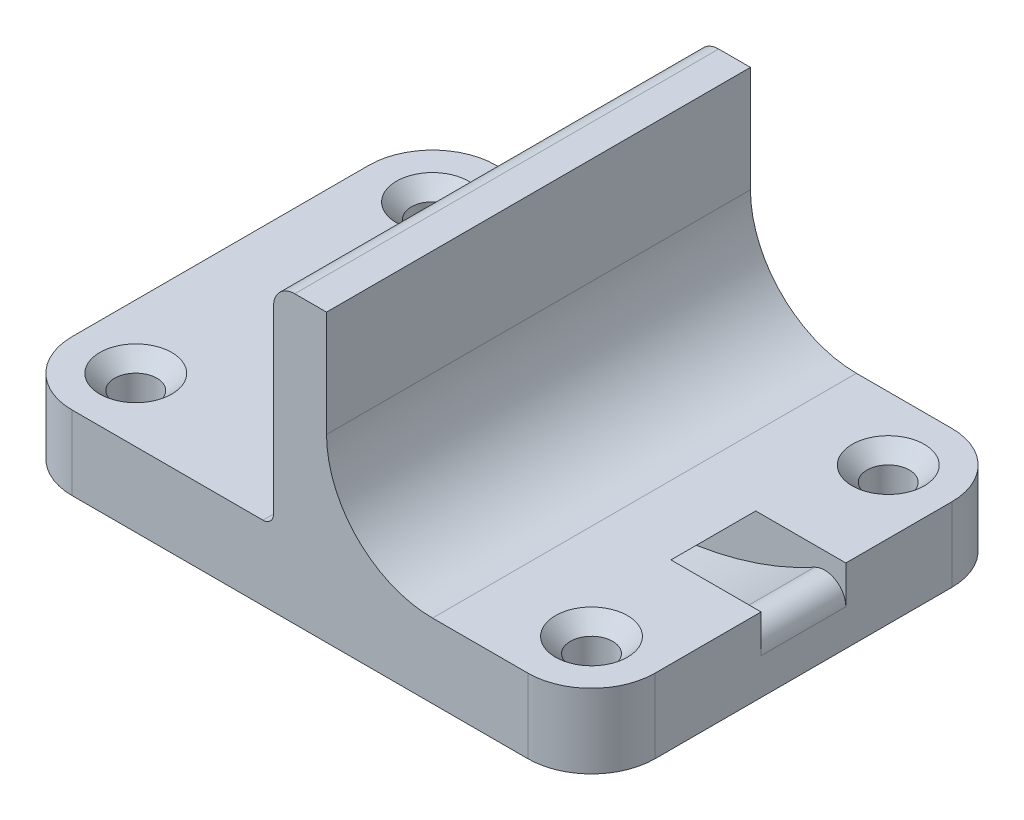
ISO-10303-21;
HEADER;
FILE_DESCRIPTION(('STEP AP214'),'2;1');
FILE_NAME('part.step','',(''),(''),'','','');
FILE_SCHEMA(('AUTOMOTIVE_DESIGN { 1 0 10303 214 1 1 1 1 }'));
ENDSEC;
DATA;
#1=APPLICATION_CONTEXT('core data for automotive mechanical design processes');
#2=APPLICATION_PROTOCOL_DEFINITION('international standard','automotive_design',2000,#1);
#3=PRODUCT_CONTEXT('',#1,'mechanical');
#4=PRODUCT('Part','Part','',(#3));
#5=PRODUCT_RELATED_PRODUCT_CATEGORY('part','',(#4));
#6=PRODUCT_DEFINITION_FORMATION('','',#4);
#7=PRODUCT_DEFINITION_CONTEXT('part definition',#1,'design');
#8=PRODUCT_DEFINITION('design','',#6,#7);
#9=PRODUCT_DEFINITION_SHAPE('','',#8);
#10=(LENGTH_UNIT() NAMED_UNIT(*) SI_UNIT(.MILLI.,.METRE.));
#11=(NAMED_UNIT(*) PLANE_ANGLE_UNIT() SI_UNIT($,.RADIAN.));
#12=(NAMED_UNIT(*) SI_UNIT($,.STERADIAN.) SOLID_ANGLE_UNIT());
#13=UNCERTAINTY_MEASURE_WITH_UNIT(LENGTH_MEASURE(1.E-05),#10,'distance_accuracy_value','');
#14=(GEOMETRIC_REPRESENTATION_CONTEXT(3) GLOBAL_UNCERTAINTY_ASSIGNED_CONTEXT((#13)) GLOBAL_UNIT_ASSIGNED_CONTEXT((#10,
#11,#12)) REPRESENTATION_CONTEXT('',''));
#15=CARTESIAN_POINT('',(0.,0.,0.));
#16=DIRECTION('',(0.,0.,1.));
#17=DIRECTION('',(1.,0.,0.));
#18=AXIS2_PLACEMENT_3D('',#15,#16,#17);
#19=CARTESIAN_POINT('',(25.,0.,40.));
#20=DIRECTION('',(0.,-1.,0.));
#21=DIRECTION('',(1.,0.,0.));
#22=AXIS2_PLACEMENT_3D('',#19,#20,#21);
#23=PLANE('',#22);
#24=CARTESIAN_POINT('',(19.,0.,6.00000000000001));
#25=DIRECTION('',(0.,-1.,0.));
#26=DIRECTION('',(1.,0.,0.));
#27=AXIS2_PLACEMENT_3D('',#24,#25,#26);
#28=CIRCLE('',#27,3.40000000000001);
#29=CARTESIAN_POINT('',(19.,0.,9.40000000000002));
#30=VERTEX_POINT('',#29);
#31=EDGE_CURVE('E363',#30,#30,#28,.T.);
#32=ORIENTED_EDGE('',*,*,#31,.T.);
#33=EDGE_LOOP('',(#32));
#34=FACE_BOUND('',#33,.T.);
#35=CARTESIAN_POINT('',(19.,0.,34.));
#36=DIRECTION('',(0.,-1.,0.));
#37=DIRECTION('',(1.,0.,0.));
#38=AXIS2_PLACEMENT_3D('',#35,#36,#37);
#39=CIRCLE('',#38,3.40000000000001);
#40=CARTESIAN_POINT('',(22.4,0.,34.));
#41=VERTEX_POINT('',#40);
#42=EDGE_CURVE('E359',#41,#41,#39,.T.);
#43=ORIENTED_EDGE('',*,*,#42,.T.);
#44=EDGE_LOOP('',(#43));
#45=FACE_BOUND('',#44,.T.);
#46=DIRECTION('',(0.,0.,-1.));
#47=VECTOR('',#46,1.);
#48=CARTESIAN_POINT('',(25.,0.,40.));
#49=LINE('',#48,#47);
#50=CARTESIAN_POINT('',(25.,0.,16.));
#51=VERTEX_POINT('',#50);
#52=CARTESIAN_POINT('',(25.,0.,6.));
#53=VERTEX_POINT('',#52);
#54=EDGE_CURVE('E267',#51,#53,#49,.T.);
#55=ORIENTED_EDGE('',*,*,#54,.T.);
#56=CARTESIAN_POINT('',(19.,0.,6.));
#57=DIRECTION('',(0.,-1.,0.));
#58=DIRECTION('',(1.,0.,0.));
#59=AXIS2_PLACEMENT_3D('',#56,#57,#58);
#60=CIRCLE('',#59,6.);
#61=CARTESIAN_POINT('',(19.,0.,0.));
#62=VERTEX_POINT('',#61);
#63=EDGE_CURVE('E438',#53,#62,#60,.F.);
#64=ORIENTED_EDGE('',*,*,#63,.T.);
#65=DIRECTION('',(-1.,0.,0.));
#66=VECTOR('',#65,1.);
#67=CARTESIAN_POINT('',(25.,0.,0.));
#68=LINE('',#67,#66);
#69=CARTESIAN_POINT('',(10.,0.,0.));
#70=VERTEX_POINT('',#69);
#71=EDGE_CURVE('E236',#62,#70,#68,.T.);
#72=ORIENTED_EDGE('',*,*,#71,.T.);
#73=DIRECTION('',(0.,0.,-1.));
#74=VECTOR('',#73,1.);
#75=CARTESIAN_POINT('',(10.,0.,40.));
#76=LINE('',#75,#74);
#77=CARTESIAN_POINT('',(10.,0.,40.));
#78=VERTEX_POINT('',#77);
#79=EDGE_CURVE('E417',#70,#78,#76,.F.);
#80=ORIENTED_EDGE('',*,*,#79,.T.);
#81=DIRECTION('',(-1.,0.,0.));
#82=VECTOR('',#81,1.);
#83=CARTESIAN_POINT('',(25.,0.,40.));
#84=LINE('',#83,#82);
#85=CARTESIAN_POINT('',(19.,0.,40.));
#86=VERTEX_POINT('',#85);
#87=EDGE_CURVE('E246',#86,#78,#84,.T.);
#88=ORIENTED_EDGE('',*,*,#87,.F.);
#89=CARTESIAN_POINT('',(19.,0.,34.));
#90=DIRECTION('',(0.,-1.,0.));
#91=DIRECTION('',(1.,0.,0.));
#92=AXIS2_PLACEMENT_3D('',#89,#90,#91);
#93=CIRCLE('',#92,6.);
#94=CARTESIAN_POINT('',(25.,0.,34.));
#95=VERTEX_POINT('',#94);
#96=EDGE_CURVE('E435',#86,#95,#93,.F.);
#97=ORIENTED_EDGE('',*,*,#96,.T.);
#98=CARTESIAN_POINT('',(25.,0.,24.));
#99=VERTEX_POINT('',#98);
#100=EDGE_CURVE('E285',#95,#99,#49,.T.);
#101=ORIENTED_EDGE('',*,*,#100,.T.);
#102=DIRECTION('',(-1.,0.,0.));
#103=VECTOR('',#102,1.);
#104=CARTESIAN_POINT('',(25.,0.,24.));
#105=LINE('',#104,#103);
#106=CARTESIAN_POINT('',(16.4975727583349,0.,24.));
#107=VERTEX_POINT('',#106);
#108=EDGE_CURVE('E234',#99,#107,#105,.T.);
#109=ORIENTED_EDGE('',*,*,#108,.T.);
#110=DIRECTION('',(0.,0.,-1.));
#111=VECTOR('',#110,1.);
#112=CARTESIAN_POINT('',(16.4975727583349,0.,24.));
#113=LINE('',#112,#111);
#114=CARTESIAN_POINT('',(16.4975727583349,0.,16.));
#115=VERTEX_POINT('',#114);
#116=EDGE_CURVE('E211',#107,#115,#113,.T.);
#117=ORIENTED_EDGE('',*,*,#116,.T.);
#118=DIRECTION('',(-1.,0.,0.));
#119=VECTOR('',#118,1.);
#120=CARTESIAN_POINT('',(25.,0.,16.));
#121=LINE('',#120,#119);
#122=EDGE_CURVE('E222',#51,#115,#121,.T.);
#123=ORIENTED_EDGE('',*,*,#122,.F.);
#124=EDGE_LOOP('',(#55,#64,#72,#80,#88,#97,#101,#109,#117,#123));
#125=FACE_BOUND('',#124,.T.);
#126=ADVANCED_FACE('F41',(#34,#45,#125),#23,.F.);
#127=CARTESIAN_POINT('',(0.,0.,40.));
#128=DIRECTION('',(-1.,0.,0.));
#129=DIRECTION('',(0.,0.,1.));
#130=AXIS2_PLACEMENT_3D('',#127,#128,#129);
#131=PLANE('',#130);
#132=DIRECTION('',(0.,1.,0.));
#133=VECTOR('',#132,1.);
#134=CARTESIAN_POINT('',(0.,0.,40.));
#135=LINE('',#134,#133);
#136=CARTESIAN_POINT('',(0.,10.,40.));
#137=VERTEX_POINT('',#136);
#138=CARTESIAN_POINT('',(0.,20.,40.));
#139=VERTEX_POINT('',#138);
#140=EDGE_CURVE('E249',#137,#139,#135,.T.);
#141=ORIENTED_EDGE('',*,*,#140,.F.);
#142=DIRECTION('',(0.,0.,-1.));
#143=VECTOR('',#142,1.);
#144=CARTESIAN_POINT('',(0.,10.,0.));
#145=LINE('',#144,#143);
#146=CARTESIAN_POINT('',(0.,10.,0.));
#147=VERTEX_POINT('',#146);
#148=EDGE_CURVE('E413',#137,#147,#145,.T.);
#149=ORIENTED_EDGE('',*,*,#148,.T.);
#150=DIRECTION('',(0.,1.,0.));
#151=VECTOR('',#150,1.);
#152=CARTESIAN_POINT('',(0.,0.,0.));
#153=LINE('',#152,#151);
#154=CARTESIAN_POINT('',(0.,20.,0.));
#155=VERTEX_POINT('',#154);
#156=EDGE_CURVE('E240',#147,#155,#153,.T.);
#157=ORIENTED_EDGE('',*,*,#156,.T.);
#158=DIRECTION('',(0.,0.,-1.));
#159=VECTOR('',#158,1.);
#160=CARTESIAN_POINT('',(0.,20.,40.));
#161=LINE('',#160,#159);
#162=EDGE_CURVE('E299',#139,#155,#161,.T.);
#163=ORIENTED_EDGE('',*,*,#162,.F.);
#164=EDGE_LOOP('',(#141,#149,#157,#163));
#165=FACE_BOUND('',#164,.T.);
#166=ADVANCED_FACE('F488',(#165),#131,.F.);
#167=CARTESIAN_POINT('',(0.,20.,40.));
#168=DIRECTION('',(0.,-1.,0.));
#169=DIRECTION('',(0.,0.,-1.));
#170=AXIS2_PLACEMENT_3D('',#167,#168,#169);
#171=PLANE('',#170);
#172=DIRECTION('',(-1.,0.,0.));
#173=VECTOR('',#172,1.);
#174=CARTESIAN_POINT('',(0.,20.,0.));
#175=LINE('',#174,#173);
#176=CARTESIAN_POINT('',(-3.,20.,0.));
#177=VERTEX_POINT('',#176);
#178=EDGE_CURVE('E271',#155,#177,#175,.T.);
#179=ORIENTED_EDGE('',*,*,#178,.T.);
#180=DIRECTION('',(0.,0.,-1.));
#181=VECTOR('',#180,1.);
#182=CARTESIAN_POINT('',(-3.,20.,40.));
#183=LINE('',#182,#181);
#184=CARTESIAN_POINT('',(-3.,20.,40.));
#185=VERTEX_POINT('',#184);
#186=EDGE_CURVE('E329',#177,#185,#183,.F.);
#187=ORIENTED_EDGE('',*,*,#186,.T.);
#188=DIRECTION('',(-1.,0.,0.));
#189=VECTOR('',#188,1.);
#190=CARTESIAN_POINT('',(0.,20.,40.));
#191=LINE('',#190,#189);
#192=EDGE_CURVE('E253',#139,#185,#191,.T.);
#193=ORIENTED_EDGE('',*,*,#192,.F.);
#194=ORIENTED_EDGE('',*,*,#162,.T.);
#195=EDGE_LOOP('',(#179,#187,#193,#194));
#196=FACE_BOUND('',#195,.T.);
#197=ADVANCED_FACE('F493',(#196),#171,.F.);
#198=CARTESIAN_POINT('',(-5.,20.,40.));
#199=DIRECTION('',(1.,0.,0.));
#200=DIRECTION('',(0.,1.,0.));
#201=AXIS2_PLACEMENT_3D('',#198,#199,#200);
#202=PLANE('',#201);
#203=DIRECTION('',(0.,-1.,0.));
#204=VECTOR('',#203,1.);
#205=CARTESIAN_POINT('',(-5.,20.,24.));
#206=LINE('',#205,#204);
#207=CARTESIAN_POINT('',(-5.,1.40803957225041,24.));
#208=VERTEX_POINT('',#207);
#209=CARTESIAN_POINT('',(-5.,1.,24.));
#210=VERTEX_POINT('',#209);
#211=EDGE_CURVE('E305',#208,#210,#206,.T.);
#212=ORIENTED_EDGE('',*,*,#211,.T.);
#213=DIRECTION('',(0.,0.,-1.));
#214=VECTOR('',#213,1.);
#215=CARTESIAN_POINT('',(-5.,1.,40.));
#216=LINE('',#215,#214);
#217=CARTESIAN_POINT('',(-5.,1.,40.));
#218=VERTEX_POINT('',#217);
#219=EDGE_CURVE('E398',#210,#218,#216,.F.);
#220=ORIENTED_EDGE('',*,*,#219,.T.);
#221=DIRECTION('',(0.,-1.,0.));
#222=VECTOR('',#221,1.);
#223=CARTESIAN_POINT('',(-5.,20.,40.));
#224=LINE('',#223,#222);
#225=CARTESIAN_POINT('',(-5.,18.,40.));
#226=VERTEX_POINT('',#225);
#227=EDGE_CURVE('E257',#226,#218,#224,.T.);
#228=ORIENTED_EDGE('',*,*,#227,.F.);
#229=DIRECTION('',(0.,0.,-1.));
#230=VECTOR('',#229,1.);
#231=CARTESIAN_POINT('',(-5.,18.,40.));
#232=LINE('',#231,#230);
#233=CARTESIAN_POINT('',(-5.,18.,0.));
#234=VERTEX_POINT('',#233);
#235=EDGE_CURVE('E322',#226,#234,#232,.T.);
#236=ORIENTED_EDGE('',*,*,#235,.T.);
#237=DIRECTION('',(0.,-1.,0.));
#238=VECTOR('',#237,1.);
#239=CARTESIAN_POINT('',(-5.,20.,0.));
#240=LINE('',#239,#238);
#241=CARTESIAN_POINT('',(-5.,1.,0.));
#242=VERTEX_POINT('',#241);
#243=EDGE_CURVE('E275',#234,#242,#240,.T.);
#244=ORIENTED_EDGE('',*,*,#243,.T.);
#245=DIRECTION('',(0.,0.,-1.));
#246=VECTOR('',#245,1.);
#247=CARTESIAN_POINT('',(-5.,1.,16.));
#248=LINE('',#247,#246);
#249=CARTESIAN_POINT('',(-5.,1.,16.));
#250=VERTEX_POINT('',#249);
#251=EDGE_CURVE('E395',#242,#250,#248,.F.);
#252=ORIENTED_EDGE('',*,*,#251,.T.);
#253=DIRECTION('',(0.,1.,0.));
#254=VECTOR('',#253,1.);
#255=CARTESIAN_POINT('',(-5.,27.8841021562439,16.));
#256=LINE('',#255,#254);
#257=CARTESIAN_POINT('',(-5.,1.40803957225041,16.));
#258=VERTEX_POINT('',#257);
#259=EDGE_CURVE('E313',#250,#258,#256,.T.);
#260=ORIENTED_EDGE('',*,*,#259,.T.);
#261=DIRECTION('',(0.,0.,-1.));
#262=VECTOR('',#261,1.);
#263=CARTESIAN_POINT('',(-5.,1.40803957225041,40.));
#264=LINE('',#263,#262);
#265=EDGE_CURVE('E309',#258,#208,#264,.F.);
#266=ORIENTED_EDGE('',*,*,#265,.T.);
#267=EDGE_LOOP('',(#212,#220,#228,#236,#244,#252,#260,#266));
#268=FACE_BOUND('',#267,.T.);
#269=ADVANCED_FACE('F502',(#268),#202,.F.);
#270=CARTESIAN_POINT('',(-5.,0.,40.));
#271=DIRECTION('',(0.,-1.,0.));
#272=DIRECTION('',(1.,0.,0.));
#273=AXIS2_PLACEMENT_3D('',#270,#271,#272);
#274=PLANE('',#273);
#275=CARTESIAN_POINT('',(-24.,0.,34.));
#276=DIRECTION('',(0.,-1.,0.));
#277=DIRECTION('',(1.,0.,0.));
#278=AXIS2_PLACEMENT_3D('',#275,#276,#277);
#279=CIRCLE('',#278,3.39999999999999);
#280=CARTESIAN_POINT('',(-20.6,0.,34.));
#281=VERTEX_POINT('',#280);
#282=EDGE_CURVE('E379',#281,#281,#279,.T.);
#283=ORIENTED_EDGE('',*,*,#282,.T.);
#284=EDGE_LOOP('',(#283));
#285=FACE_BOUND('',#284,.T.);
#286=CARTESIAN_POINT('',(-24.,0.,6.00000000000001));
#287=DIRECTION('',(0.,-1.,0.));
#288=DIRECTION('',(1.,0.,0.));
#289=AXIS2_PLACEMENT_3D('',#286,#287,#288);
#290=CIRCLE('',#289,3.39999999999999);
#291=CARTESIAN_POINT('',(-20.6,0.,6.00000000000001));
#292=VERTEX_POINT('',#291);
#293=EDGE_CURVE('E375',#292,#292,#290,.T.);
#294=ORIENTED_EDGE('',*,*,#293,.T.);
#295=EDGE_LOOP('',(#294));
#296=FACE_BOUND('',#295,.T.);
#297=DIRECTION('',(-1.,0.,0.));
#298=VECTOR('',#297,1.);
#299=CARTESIAN_POINT('',(-5.,0.,0.));
#300=LINE('',#299,#298);
#301=CARTESIAN_POINT('',(-6.,0.,0.));
#302=VERTEX_POINT('',#301);
#303=CARTESIAN_POINT('',(-24.,0.,0.));
#304=VERTEX_POINT('',#303);
#305=EDGE_CURVE('E279',#302,#304,#300,.T.);
#306=ORIENTED_EDGE('',*,*,#305,.T.);
#307=CARTESIAN_POINT('',(-24.,0.,6.));
#308=DIRECTION('',(0.,-1.,0.));
#309=DIRECTION('',(1.,0.,0.));
#310=AXIS2_PLACEMENT_3D('',#307,#308,#309);
#311=CIRCLE('',#310,6.);
#312=CARTESIAN_POINT('',(-30.,0.,6.));
#313=VERTEX_POINT('',#312);
#314=EDGE_CURVE('E63',#304,#313,#311,.F.);
#315=ORIENTED_EDGE('',*,*,#314,.T.);
#316=DIRECTION('',(0.,0.,-1.));
#317=VECTOR('',#316,1.);
#318=CARTESIAN_POINT('',(-30.,0.,40.));
#319=LINE('',#318,#317);
#320=CARTESIAN_POINT('',(-30.,0.,34.));
#321=VERTEX_POINT('',#320);
#322=EDGE_CURVE('E296',#321,#313,#319,.T.);
#323=ORIENTED_EDGE('',*,*,#322,.F.);
#324=CARTESIAN_POINT('',(-24.,0.,34.));
#325=DIRECTION('',(0.,-1.,0.));
#326=DIRECTION('',(1.,0.,0.));
#327=AXIS2_PLACEMENT_3D('',#324,#325,#326);
#328=CIRCLE('',#327,6.);
#329=CARTESIAN_POINT('',(-24.,0.,40.));
#330=VERTEX_POINT('',#329);
#331=EDGE_CURVE('E57',#321,#330,#328,.F.);
#332=ORIENTED_EDGE('',*,*,#331,.T.);
#333=DIRECTION('',(-1.,0.,0.));
#334=VECTOR('',#333,1.);
#335=CARTESIAN_POINT('',(-5.,0.,40.));
#336=LINE('',#335,#334);
#337=CARTESIAN_POINT('',(-6.,0.,40.));
#338=VERTEX_POINT('',#337);
#339=EDGE_CURVE('E261',#338,#330,#336,.T.);
#340=ORIENTED_EDGE('',*,*,#339,.F.);
#341=DIRECTION('',(0.,0.,-1.));
#342=VECTOR('',#341,1.);
#343=CARTESIAN_POINT('',(-6.,0.,24.));
#344=LINE('',#343,#342);
#345=CARTESIAN_POINT('',(-6.,0.,24.));
#346=VERTEX_POINT('',#345);
#347=EDGE_CURVE('E391',#338,#346,#344,.T.);
#348=ORIENTED_EDGE('',*,*,#347,.T.);
#349=DIRECTION('',(-1.,0.,0.));
#350=VECTOR('',#349,1.);
#351=CARTESIAN_POINT('',(-5.,0.,24.));
#352=LINE('',#351,#350);
#353=CARTESIAN_POINT('',(-13.502427241665,0.,24.));
#354=VERTEX_POINT('',#353);
#355=EDGE_CURVE('E242',#346,#354,#352,.T.);
#356=ORIENTED_EDGE('',*,*,#355,.T.);
#357=DIRECTION('',(0.,0.,-1.));
#358=VECTOR('',#357,1.);
#359=CARTESIAN_POINT('',(-13.502427241665,0.,24.));
#360=LINE('',#359,#358);
#361=CARTESIAN_POINT('',(-13.502427241665,0.,16.));
#362=VERTEX_POINT('',#361);
#363=EDGE_CURVE('E230',#362,#354,#360,.F.);
#364=ORIENTED_EDGE('',*,*,#363,.F.);
#365=DIRECTION('',(-1.,0.,0.));
#366=VECTOR('',#365,1.);
#367=CARTESIAN_POINT('',(-5.,0.,16.));
#368=LINE('',#367,#366);
#369=CARTESIAN_POINT('',(-6.,0.,16.));
#370=VERTEX_POINT('',#369);
#371=EDGE_CURVE('E231',#370,#362,#368,.T.);
#372=ORIENTED_EDGE('',*,*,#371,.F.);
#373=DIRECTION('',(0.,0.,-1.));
#374=VECTOR('',#373,1.);
#375=CARTESIAN_POINT('',(-6.,0.,0.));
#376=LINE('',#375,#374);
#377=EDGE_CURVE('E387',#370,#302,#376,.T.);
#378=ORIENTED_EDGE('',*,*,#377,.T.);
#379=EDGE_LOOP('',(#306,#315,#323,#332,#340,#348,#356,#364,#372,#378));
#380=FACE_BOUND('',#379,.T.);
#381=ADVANCED_FACE('F512',(#285,#296,#380),#274,.F.);
#382=CARTESIAN_POINT('',(-30.,0.,40.));
#383=DIRECTION('',(1.,0.,0.));
#384=DIRECTION('',(0.,0.,-1.));
#385=AXIS2_PLACEMENT_3D('',#382,#383,#384);
#386=PLANE('',#385);
#387=ORIENTED_EDGE('',*,*,#322,.T.);
#388=DIRECTION('',(0.,-1.,0.));
#389=VECTOR('',#388,1.);
#390=CARTESIAN_POINT('',(-30.,-7.,6.));
#391=LINE('',#390,#389);
#392=CARTESIAN_POINT('',(-30.,-7.,6.));
#393=VERTEX_POINT('',#392);
#394=EDGE_CURVE('E462',#313,#393,#391,.T.);
#395=ORIENTED_EDGE('',*,*,#394,.T.);
#396=DIRECTION('',(0.,0.,-1.));
#397=VECTOR('',#396,1.);
#398=CARTESIAN_POINT('',(-30.,-7.,40.));
#399=LINE('',#398,#397);
#400=CARTESIAN_POINT('',(-30.,-7.,34.));
#401=VERTEX_POINT('',#400);
#402=EDGE_CURVE('E292',#401,#393,#399,.T.);
#403=ORIENTED_EDGE('',*,*,#402,.F.);
#404=DIRECTION('',(0.,-1.,0.));
#405=VECTOR('',#404,1.);
#406=CARTESIAN_POINT('',(-30.,0.,34.));
#407=LINE('',#406,#405);
#408=EDGE_CURVE('E459',#401,#321,#407,.F.);
#409=ORIENTED_EDGE('',*,*,#408,.T.);
#410=EDGE_LOOP('',(#387,#395,#403,#409));
#411=FACE_BOUND('',#410,.T.);
#412=ADVANCED_FACE('F566',(#411),#386,.F.);
#413=CARTESIAN_POINT('',(-30.,-7.,40.));
#414=DIRECTION('',(0.,1.,0.));
#415=DIRECTION('',(0.,0.,1.));
#416=AXIS2_PLACEMENT_3D('',#413,#414,#415);
#417=PLANE('',#416);
#418=CARTESIAN_POINT('',(19.,-7.,6.00000000000001));
#419=DIRECTION('',(0.,1.,0.));
#420=DIRECTION('',(0.,0.,1.));
#421=AXIS2_PLACEMENT_3D('',#418,#419,#420);
#422=CIRCLE('',#421,2.);
#423=CARTESIAN_POINT('',(19.,-7.,8.00000000000001));
#424=VERTEX_POINT('',#423);
#425=EDGE_CURVE('E548',#424,#424,#422,.F.);
#426=ORIENTED_EDGE('',*,*,#425,.F.);
#427=EDGE_LOOP('',(#426));
#428=FACE_BOUND('',#427,.T.);
#429=CARTESIAN_POINT('',(19.,-7.,34.));
#430=DIRECTION('',(0.,1.,0.));
#431=DIRECTION('',(0.,0.,1.));
#432=AXIS2_PLACEMENT_3D('',#429,#430,#431);
#433=CIRCLE('',#432,2.);
#434=CARTESIAN_POINT('',(19.,-7.,36.));
#435=VERTEX_POINT('',#434);
#436=EDGE_CURVE('E552',#435,#435,#433,.F.);
#437=ORIENTED_EDGE('',*,*,#436,.F.);
#438=EDGE_LOOP('',(#437));
#439=FACE_BOUND('',#438,.T.);
#440=CARTESIAN_POINT('',(-24.,-7.,34.));
#441=DIRECTION('',(0.,1.,0.));
#442=DIRECTION('',(0.,0.,1.));
#443=AXIS2_PLACEMENT_3D('',#440,#441,#442);
#444=CIRCLE('',#443,2.);
#445=CARTESIAN_POINT('',(-24.,-7.,36.));
#446=VERTEX_POINT('',#445);
#447=EDGE_CURVE('E547',#446,#446,#444,.F.);
#448=ORIENTED_EDGE('',*,*,#447,.F.);
#449=EDGE_LOOP('',(#448));
#450=FACE_BOUND('',#449,.T.);
#451=CARTESIAN_POINT('',(-24.,-7.,6.00000000000001));
#452=DIRECTION('',(0.,1.,0.));
#453=DIRECTION('',(0.,0.,1.));
#454=AXIS2_PLACEMENT_3D('',#451,#452,#453);
#455=CIRCLE('',#454,2.);
#456=CARTESIAN_POINT('',(-24.,-7.,8.00000000000001));
#457=VERTEX_POINT('',#456);
#458=EDGE_CURVE('E219',#457,#457,#455,.F.);
#459=ORIENTED_EDGE('',*,*,#458,.F.);
#460=EDGE_LOOP('',(#459));
#461=FACE_BOUND('',#460,.T.);
#462=DIRECTION('',(1.,0.,0.));
#463=VECTOR('',#462,1.);
#464=CARTESIAN_POINT('',(-30.,-7.,0.));
#465=LINE('',#464,#463);
#466=CARTESIAN_POINT('',(-24.,-7.,0.));
#467=VERTEX_POINT('',#466);
#468=CARTESIAN_POINT('',(19.,-7.,0.));
#469=VERTEX_POINT('',#468);
#470=EDGE_CURVE('E250',#467,#469,#465,.T.);
#471=ORIENTED_EDGE('',*,*,#470,.T.);
#472=CARTESIAN_POINT('',(19.,-7.,6.));
#473=DIRECTION('',(0.,1.,0.));
#474=DIRECTION('',(0.,0.,1.));
#475=AXIS2_PLACEMENT_3D('',#472,#473,#474);
#476=CIRCLE('',#475,6.);
#477=CARTESIAN_POINT('',(25.,-7.,6.));
#478=VERTEX_POINT('',#477);
#479=EDGE_CURVE('E456',#469,#478,#476,.F.);
#480=ORIENTED_EDGE('',*,*,#479,.T.);
#481=DIRECTION('',(0.,0.,-1.));
#482=VECTOR('',#481,1.);
#483=CARTESIAN_POINT('',(25.,-7.,40.));
#484=LINE('',#483,#482);
#485=CARTESIAN_POINT('',(25.,-7.,34.));
#486=VERTEX_POINT('',#485);
#487=EDGE_CURVE('E288',#486,#478,#484,.T.);
#488=ORIENTED_EDGE('',*,*,#487,.F.);
#489=CARTESIAN_POINT('',(19.,-7.,34.));
#490=DIRECTION('',(0.,1.,0.));
#491=DIRECTION('',(0.,0.,1.));
#492=AXIS2_PLACEMENT_3D('',#489,#490,#491);
#493=CIRCLE('',#492,6.);
#494=CARTESIAN_POINT('',(19.,-7.,40.));
#495=VERTEX_POINT('',#494);
#496=EDGE_CURVE('E447',#486,#495,#493,.F.);
#497=ORIENTED_EDGE('',*,*,#496,.T.);
#498=DIRECTION('',(1.,0.,0.));
#499=VECTOR('',#498,1.);
#500=CARTESIAN_POINT('',(-30.,-7.,40.));
#501=LINE('',#500,#499);
#502=CARTESIAN_POINT('',(-24.,-7.,40.));
#503=VERTEX_POINT('',#502);
#504=EDGE_CURVE('E264',#503,#495,#501,.T.);
#505=ORIENTED_EDGE('',*,*,#504,.F.);
#506=CARTESIAN_POINT('',(-24.,-7.,34.));
#507=DIRECTION('',(0.,1.,0.));
#508=DIRECTION('',(0.,0.,1.));
#509=AXIS2_PLACEMENT_3D('',#506,#507,#508);
#510=CIRCLE('',#509,6.);
#511=EDGE_CURVE('E450',#503,#401,#510,.F.);
#512=ORIENTED_EDGE('',*,*,#511,.T.);
#513=ORIENTED_EDGE('',*,*,#402,.T.);
#514=CARTESIAN_POINT('',(-24.,-7.,6.));
#515=DIRECTION('',(0.,1.,0.));
#516=DIRECTION('',(0.,0.,1.));
#517=AXIS2_PLACEMENT_3D('',#514,#515,#516);
#518=CIRCLE('',#517,6.);
#519=EDGE_CURVE('E453',#393,#467,#518,.F.);
#520=ORIENTED_EDGE('',*,*,#519,.T.);
#521=EDGE_LOOP('',(#471,#480,#488,#497,#505,#512,#513,#520));
#522=FACE_BOUND('',#521,.T.);
#523=ADVANCED_FACE('F562',(#428,#439,#450,#461,#522),#417,.F.);
#524=CARTESIAN_POINT('',(25.,-7.,40.));
#525=DIRECTION('',(-1.,0.,0.));
#526=DIRECTION('',(0.,0.,1.));
#527=AXIS2_PLACEMENT_3D('',#524,#525,#526);
#528=PLANE('',#527);
#529=ORIENTED_EDGE('',*,*,#487,.T.);
#530=DIRECTION('',(0.,1.,0.));
#531=VECTOR('',#530,1.);
#532=CARTESIAN_POINT('',(25.,0.,6.));
#533=LINE('',#532,#531);
#534=EDGE_CURVE('E431',#478,#53,#533,.T.);
#535=ORIENTED_EDGE('',*,*,#534,.T.);
#536=ORIENTED_EDGE('',*,*,#54,.F.);
#537=DIRECTION('',(0.,-1.,0.));
#538=VECTOR('',#537,1.);
#539=CARTESIAN_POINT('',(25.,27.8841021562439,16.));
#540=LINE('',#539,#538);
#541=CARTESIAN_POINT('',(25.,-3.58118691231785,16.));
#542=VERTEX_POINT('',#541);
#543=EDGE_CURVE('E225',#51,#542,#540,.T.);
#544=ORIENTED_EDGE('',*,*,#543,.T.);
#545=DIRECTION('',(0.,0.,1.));
#546=VECTOR('',#545,1.);
#547=CARTESIAN_POINT('',(25.,-3.58118691231785,24.));
#548=LINE('',#547,#546);
#549=CARTESIAN_POINT('',(25.,-3.58118691231785,24.));
#550=VERTEX_POINT('',#549);
#551=EDGE_CURVE('E343',#542,#550,#548,.T.);
#552=ORIENTED_EDGE('',*,*,#551,.T.);
#553=DIRECTION('',(0.,1.,0.));
#554=VECTOR('',#553,1.);
#555=CARTESIAN_POINT('',(25.,-7.,24.));
#556=LINE('',#555,#554);
#557=EDGE_CURVE('E339',#550,#99,#556,.T.);
#558=ORIENTED_EDGE('',*,*,#557,.T.);
#559=ORIENTED_EDGE('',*,*,#100,.F.);
#560=DIRECTION('',(0.,1.,0.));
#561=VECTOR('',#560,1.);
#562=CARTESIAN_POINT('',(25.,-7.,34.));
#563=LINE('',#562,#561);
#564=EDGE_CURVE('E428',#95,#486,#563,.F.);
#565=ORIENTED_EDGE('',*,*,#564,.T.);
#566=EDGE_LOOP('',(#529,#535,#536,#544,#552,#558,#559,#565));
#567=FACE_BOUND('',#566,.T.);
#568=ADVANCED_FACE('F565',(#567),#528,.F.);
#569=CARTESIAN_POINT('',(0.,0.,40.));
#570=DIRECTION('',(0.,0.,-1.));
#571=DIRECTION('',(-1.,0.,0.));
#572=AXIS2_PLACEMENT_3D('',#569,#570,#571);
#573=PLANE('',#572);
#574=ORIENTED_EDGE('',*,*,#339,.T.);
#575=DIRECTION('',(0.,-1.,0.));
#576=VECTOR('',#575,1.);
#577=CARTESIAN_POINT('',(-24.,0.,40.));
#578=LINE('',#577,#576);
#579=EDGE_CURVE('E11',#330,#503,#578,.T.);
#580=ORIENTED_EDGE('',*,*,#579,.T.);
#581=ORIENTED_EDGE('',*,*,#504,.T.);
#582=DIRECTION('',(0.,1.,0.));
#583=VECTOR('',#582,1.);
#584=CARTESIAN_POINT('',(19.,0.,40.));
#585=LINE('',#584,#583);
#586=EDGE_CURVE('E50',#495,#86,#585,.T.);
#587=ORIENTED_EDGE('',*,*,#586,.T.);
#588=ORIENTED_EDGE('',*,*,#87,.T.);
#589=CARTESIAN_POINT('',(10.,10.,40.));
#590=DIRECTION('',(0.,0.,-1.));
#591=DIRECTION('',(-1.,0.,0.));
#592=AXIS2_PLACEMENT_3D('',#589,#590,#591);
#593=CIRCLE('',#592,10.);
#594=EDGE_CURVE('E425',#78,#137,#593,.T.);
#595=ORIENTED_EDGE('',*,*,#594,.T.);
#596=ORIENTED_EDGE('',*,*,#140,.T.);
#597=ORIENTED_EDGE('',*,*,#192,.T.);
#598=CARTESIAN_POINT('',(-3.,18.,40.));
#599=DIRECTION('',(0.,0.,-1.));
#600=DIRECTION('',(-1.,0.,0.));
#601=AXIS2_PLACEMENT_3D('',#598,#599,#600);
#602=CIRCLE('',#601,2.);
#603=EDGE_CURVE('E332',#185,#226,#602,.F.);
#604=ORIENTED_EDGE('',*,*,#603,.T.);
#605=ORIENTED_EDGE('',*,*,#227,.T.);
#606=CARTESIAN_POINT('',(-6.,1.,40.));
#607=DIRECTION('',(0.,0.,-1.));
#608=DIRECTION('',(-1.,0.,0.));
#609=AXIS2_PLACEMENT_3D('',#606,#607,#608);
#610=CIRCLE('',#609,1.);
#611=EDGE_CURVE('E404',#218,#338,#610,.T.);
#612=ORIENTED_EDGE('',*,*,#611,.T.);
#613=EDGE_LOOP('',(#574,#580,#581,#587,#588,#595,#596,#597,#604,#605,#612));
#614=FACE_BOUND('',#613,.T.);
#615=ADVANCED_FACE('F474',(#614),#573,.F.);
#616=CARTESIAN_POINT('',(0.,0.,0.));
#617=DIRECTION('',(0.,0.,-1.));
#618=DIRECTION('',(-1.,0.,0.));
#619=AXIS2_PLACEMENT_3D('',#616,#617,#618);
#620=PLANE('',#619);
#621=ORIENTED_EDGE('',*,*,#71,.F.);
#622=DIRECTION('',(0.,1.,0.));
#623=VECTOR('',#622,1.);
#624=CARTESIAN_POINT('',(19.,-7.,0.));
#625=LINE('',#624,#623);
#626=EDGE_CURVE('E444',#62,#469,#625,.F.);
#627=ORIENTED_EDGE('',*,*,#626,.T.);
#628=ORIENTED_EDGE('',*,*,#470,.F.);
#629=DIRECTION('',(0.,-1.,0.));
#630=VECTOR('',#629,1.);
#631=CARTESIAN_POINT('',(-24.,0.,0.));
#632=LINE('',#631,#630);
#633=EDGE_CURVE('E441',#467,#304,#632,.F.);
#634=ORIENTED_EDGE('',*,*,#633,.T.);
#635=ORIENTED_EDGE('',*,*,#305,.F.);
#636=CARTESIAN_POINT('',(-6.,1.,0.));
#637=DIRECTION('',(0.,0.,-1.));
#638=DIRECTION('',(-1.,0.,0.));
#639=AXIS2_PLACEMENT_3D('',#636,#637,#638);
#640=CIRCLE('',#639,1.);
#641=EDGE_CURVE('E407',#302,#242,#640,.F.);
#642=ORIENTED_EDGE('',*,*,#641,.T.);
#643=ORIENTED_EDGE('',*,*,#243,.F.);
#644=CARTESIAN_POINT('',(-3.,18.,0.));
#645=DIRECTION('',(0.,0.,-1.));
#646=DIRECTION('',(-1.,0.,0.));
#647=AXIS2_PLACEMENT_3D('',#644,#645,#646);
#648=CIRCLE('',#647,2.);
#649=EDGE_CURVE('E326',#234,#177,#648,.T.);
#650=ORIENTED_EDGE('',*,*,#649,.T.);
#651=ORIENTED_EDGE('',*,*,#178,.F.);
#652=ORIENTED_EDGE('',*,*,#156,.F.);
#653=CARTESIAN_POINT('',(10.,10.,0.));
#654=DIRECTION('',(0.,0.,-1.));
#655=DIRECTION('',(-1.,0.,0.));
#656=AXIS2_PLACEMENT_3D('',#653,#654,#655);
#657=CIRCLE('',#656,10.);
#658=EDGE_CURVE('E421',#147,#70,#657,.F.);
#659=ORIENTED_EDGE('',*,*,#658,.T.);
#660=EDGE_LOOP('',(#621,#627,#628,#634,#635,#642,#643,#650,#651,#652,#659));
#661=FACE_BOUND('',#660,.T.);
#662=ADVANCED_FACE('F505',(#661),#620,.T.);
#663=CARTESIAN_POINT('',(5.74878637916748,27.8841021562439,24.));
#664=DIRECTION('',(0.,0.,-1.));
#665=DIRECTION('',(-1.,0.,0.));
#666=AXIS2_PLACEMENT_3D('',#663,#664,#665);
#667=CYLINDRICAL_SURFACE('',#666,29.8841021562439);
#668=CARTESIAN_POINT('',(5.74878637916748,27.8841021562439,24.));
#669=DIRECTION('',(0.,0.,1.));
#670=DIRECTION('',(1.,0.,0.));
#671=AXIS2_PLACEMENT_3D('',#668,#669,#670);
#672=CIRCLE('',#671,29.8841021562439);
#673=CARTESIAN_POINT('',(-3.6275107105938,-0.490968144450616,24.));
#674=VERTEX_POINT('',#673);
#675=EDGE_CURVE('E522',#674,#107,#672,.T.);
#676=ORIENTED_EDGE('',*,*,#675,.F.);
#677=DIRECTION('',(0.,0.,-1.));
#678=VECTOR('',#677,1.);
#679=CARTESIAN_POINT('',(-3.62751071059381,-0.490968144450616,24.));
#680=LINE('',#679,#678);
#681=CARTESIAN_POINT('',(-3.6275107105938,-0.490968144450616,16.));
#682=VERTEX_POINT('',#681);
#683=EDGE_CURVE('E214',#674,#682,#680,.T.);
#684=ORIENTED_EDGE('',*,*,#683,.T.);
#685=CARTESIAN_POINT('',(5.74878637916748,27.8841021562439,16.));
#686=DIRECTION('',(0.,0.,1.));
#687=DIRECTION('',(1.,0.,0.));
#688=AXIS2_PLACEMENT_3D('',#685,#686,#687);
#689=CIRCLE('',#688,29.8841021562439);
#690=EDGE_CURVE('E206',#682,#115,#689,.T.);
#691=ORIENTED_EDGE('',*,*,#690,.T.);
#692=ORIENTED_EDGE('',*,*,#116,.F.);
#693=EDGE_LOOP('',(#676,#684,#691,#692));
#694=FACE_BOUND('',#693,.T.);
#695=ADVANCED_FACE('F209',(#694),#667,.T.);
#696=CARTESIAN_POINT('',(5.74878637916748,27.8841021562439,24.));
#697=DIRECTION('',(0.,0.,1.));
#698=DIRECTION('',(1.,0.,0.));
#699=AXIS2_PLACEMENT_3D('',#696,#697,#698);
#700=PLANE('',#699);
#701=CARTESIAN_POINT('',(5.74878637916748,27.8841021562439,24.));
#702=DIRECTION('',(0.,0.,1.));
#703=DIRECTION('',(1.,0.,0.));
#704=AXIS2_PLACEMENT_3D('',#701,#702,#703);
#705=CIRCLE('',#704,33.8841021562439);
#706=CARTESIAN_POINT('',(22.0385038173329,-1.82746940635613,24.));
#707=VERTEX_POINT('',#706);
#708=EDGE_CURVE('E518',#354,#707,#705,.T.);
#709=ORIENTED_EDGE('',*,*,#708,.F.);
#710=ORIENTED_EDGE('',*,*,#355,.F.);
#711=CARTESIAN_POINT('',(-6.,1.,24.));
#712=DIRECTION('',(0.,0.,1.));
#713=DIRECTION('',(1.,0.,0.));
#714=AXIS2_PLACEMENT_3D('',#711,#712,#713);
#715=CIRCLE('',#714,1.);
#716=EDGE_CURVE('E401',#346,#210,#715,.T.);
#717=ORIENTED_EDGE('',*,*,#716,.T.);
#718=ORIENTED_EDGE('',*,*,#211,.F.);
#719=CARTESIAN_POINT('',(-3.,1.40803957225041,24.));
#720=DIRECTION('',(0.,0.,1.));
#721=DIRECTION('',(1.,0.,0.));
#722=AXIS2_PLACEMENT_3D('',#719,#720,#721);
#723=CIRCLE('',#722,2.);
#724=EDGE_CURVE('E319',#208,#674,#723,.T.);
#725=ORIENTED_EDGE('',*,*,#724,.T.);
#726=ORIENTED_EDGE('',*,*,#675,.T.);
#727=ORIENTED_EDGE('',*,*,#108,.F.);
#728=ORIENTED_EDGE('',*,*,#557,.F.);
#729=CARTESIAN_POINT('',(23.,-3.58118691231785,24.));
#730=DIRECTION('',(0.,0.,1.));
#731=DIRECTION('',(1.,0.,0.));
#732=AXIS2_PLACEMENT_3D('',#729,#730,#731);
#733=CIRCLE('',#732,2.);
#734=EDGE_CURVE('E352',#550,#707,#733,.T.);
#735=ORIENTED_EDGE('',*,*,#734,.T.);
#736=EDGE_LOOP('',(#709,#710,#717,#718,#725,#726,#727,#728,#735));
#737=FACE_BOUND('',#736,.T.);
#738=ADVANCED_FACE('F535',(#737),#700,.F.);
#739=CARTESIAN_POINT('',(5.74878637916748,27.8841021562439,24.));
#740=DIRECTION('',(0.,0.,-1.));
#741=DIRECTION('',(-1.,0.,0.));
#742=AXIS2_PLACEMENT_3D('',#739,#740,#741);
#743=CYLINDRICAL_SURFACE('',#742,33.8841021562439);
#744=ORIENTED_EDGE('',*,*,#708,.T.);
#745=DIRECTION('',(0.,0.,-1.));
#746=VECTOR('',#745,1.);
#747=CARTESIAN_POINT('',(22.0385038173329,-1.82746940635613,24.));
#748=LINE('',#747,#746);
#749=CARTESIAN_POINT('',(22.0385038173329,-1.82746940635613,16.));
#750=VERTEX_POINT('',#749);
#751=EDGE_CURVE('E335',#707,#750,#748,.T.);
#752=ORIENTED_EDGE('',*,*,#751,.T.);
#753=CARTESIAN_POINT('',(5.74878637916748,27.8841021562439,16.));
#754=DIRECTION('',(0.,0.,1.));
#755=DIRECTION('',(1.,0.,0.));
#756=AXIS2_PLACEMENT_3D('',#753,#754,#755);
#757=CIRCLE('',#756,33.8841021562439);
#758=EDGE_CURVE('E218',#362,#750,#757,.T.);
#759=ORIENTED_EDGE('',*,*,#758,.F.);
#760=ORIENTED_EDGE('',*,*,#363,.T.);
#761=EDGE_LOOP('',(#744,#752,#759,#760));
#762=FACE_BOUND('',#761,.T.);
#763=ADVANCED_FACE('F533',(#762),#743,.F.);
#764=CARTESIAN_POINT('',(5.74878637916748,27.8841021562439,16.));
#765=DIRECTION('',(0.,0.,1.));
#766=DIRECTION('',(1.,0.,0.));
#767=AXIS2_PLACEMENT_3D('',#764,#765,#766);
#768=PLANE('',#767);
#769=ORIENTED_EDGE('',*,*,#122,.T.);
#770=ORIENTED_EDGE('',*,*,#690,.F.);
#771=CARTESIAN_POINT('',(-3.,1.40803957225041,16.));
#772=DIRECTION('',(0.,0.,1.));
#773=DIRECTION('',(1.,0.,0.));
#774=AXIS2_PLACEMENT_3D('',#771,#772,#773);
#775=CIRCLE('',#774,2.);
#776=EDGE_CURVE('E316',#682,#258,#775,.F.);
#777=ORIENTED_EDGE('',*,*,#776,.T.);
#778=ORIENTED_EDGE('',*,*,#259,.F.);
#779=CARTESIAN_POINT('',(-6.,1.,16.));
#780=DIRECTION('',(0.,0.,1.));
#781=DIRECTION('',(1.,0.,0.));
#782=AXIS2_PLACEMENT_3D('',#779,#780,#781);
#783=CIRCLE('',#782,1.);
#784=EDGE_CURVE('E410',#250,#370,#783,.F.);
#785=ORIENTED_EDGE('',*,*,#784,.T.);
#786=ORIENTED_EDGE('',*,*,#371,.T.);
#787=ORIENTED_EDGE('',*,*,#758,.T.);
#788=CARTESIAN_POINT('',(23.,-3.58118691231785,16.));
#789=DIRECTION('',(0.,0.,1.));
#790=DIRECTION('',(1.,0.,0.));
#791=AXIS2_PLACEMENT_3D('',#788,#789,#790);
#792=CIRCLE('',#791,2.);
#793=EDGE_CURVE('E349',#750,#542,#792,.F.);
#794=ORIENTED_EDGE('',*,*,#793,.T.);
#795=ORIENTED_EDGE('',*,*,#543,.F.);
#796=EDGE_LOOP('',(#769,#770,#777,#778,#785,#786,#787,#794,#795));
#797=FACE_BOUND('',#796,.T.);
#798=ADVANCED_FACE('F223',(#797),#768,.T.);
#799=CARTESIAN_POINT('',(-3.,1.40803957225041,24.));
#800=DIRECTION('',(0.,0.,-1.));
#801=DIRECTION('',(-1.,0.,0.));
#802=AXIS2_PLACEMENT_3D('',#799,#800,#801);
#803=CYLINDRICAL_SURFACE('',#802,2.);
#804=ORIENTED_EDGE('',*,*,#724,.F.);
#805=ORIENTED_EDGE('',*,*,#265,.F.);
#806=ORIENTED_EDGE('',*,*,#776,.F.);
#807=ORIENTED_EDGE('',*,*,#683,.F.);
#808=EDGE_LOOP('',(#804,#805,#806,#807));
#809=FACE_BOUND('',#808,.T.);
#810=ADVANCED_FACE('F599',(#809),#803,.T.);
#811=CARTESIAN_POINT('',(-3.,18.,40.));
#812=DIRECTION('',(0.,0.,-1.));
#813=DIRECTION('',(-1.,0.,0.));
#814=AXIS2_PLACEMENT_3D('',#811,#812,#813);
#815=CYLINDRICAL_SURFACE('',#814,2.);
#816=ORIENTED_EDGE('',*,*,#603,.F.);
#817=ORIENTED_EDGE('',*,*,#186,.F.);
#818=ORIENTED_EDGE('',*,*,#649,.F.);
#819=ORIENTED_EDGE('',*,*,#235,.F.);
#820=EDGE_LOOP('',(#816,#817,#818,#819));
#821=FACE_BOUND('',#820,.T.);
#822=ADVANCED_FACE('F499',(#821),#815,.T.);
#823=CARTESIAN_POINT('',(23.,-3.58118691231785,24.));
#824=DIRECTION('',(0.,0.,-1.));
#825=DIRECTION('',(-1.,0.,0.));
#826=AXIS2_PLACEMENT_3D('',#823,#824,#825);
#827=CYLINDRICAL_SURFACE('',#826,2.);
#828=ORIENTED_EDGE('',*,*,#734,.F.);
#829=ORIENTED_EDGE('',*,*,#551,.F.);
#830=ORIENTED_EDGE('',*,*,#793,.F.);
#831=ORIENTED_EDGE('',*,*,#751,.F.);
#832=EDGE_LOOP('',(#828,#829,#830,#831));
#833=FACE_BOUND('',#832,.T.);
#834=ADVANCED_FACE('F539',(#833),#827,.T.);
#835=CARTESIAN_POINT('',(-24.,-12.6568542494924,6.00000000000001));
#836=DIRECTION('',(0.,1.,0.));
#837=DIRECTION('',(-1.,0.,0.));
#838=AXIS2_PLACEMENT_3D('',#835,#836,#837);
#839=CYLINDRICAL_SURFACE('',#838,2.);
#840=CARTESIAN_POINT('',(-24.,-1.39999999999999,6.00000000000001));
#841=DIRECTION('',(0.,-1.,0.));
#842=DIRECTION('',(0.,0.,-1.));
#843=AXIS2_PLACEMENT_3D('',#840,#841,#842);
#844=CIRCLE('',#843,2.);
#845=CARTESIAN_POINT('',(-24.,-1.39999999999999,4.));
#846=VERTEX_POINT('',#845);
#847=EDGE_CURVE('E383',#846,#846,#844,.F.);
#848=ORIENTED_EDGE('',*,*,#847,.T.);
#849=EDGE_LOOP('',(#848));
#850=FACE_BOUND('',#849,.T.);
#851=ORIENTED_EDGE('',*,*,#458,.T.);
#852=EDGE_LOOP('',(#851));
#853=FACE_BOUND('',#852,.T.);
#854=ADVANCED_FACE('F607',(#850,#853),#839,.F.);
#855=CARTESIAN_POINT('',(-24.,-12.6568542494924,34.));
#856=DIRECTION('',(0.,1.,0.));
#857=DIRECTION('',(-1.,0.,0.));
#858=AXIS2_PLACEMENT_3D('',#855,#856,#857);
#859=CYLINDRICAL_SURFACE('',#858,2.);
#860=CARTESIAN_POINT('',(-24.,-1.39999999999999,34.));
#861=DIRECTION('',(0.,-1.,0.));
#862=DIRECTION('',(0.,0.,-1.));
#863=AXIS2_PLACEMENT_3D('',#860,#861,#862);
#864=CIRCLE('',#863,2.);
#865=CARTESIAN_POINT('',(-24.,-1.39999999999999,32.));
#866=VERTEX_POINT('',#865);
#867=EDGE_CURVE('E371',#866,#866,#864,.F.);
#868=ORIENTED_EDGE('',*,*,#867,.T.);
#869=EDGE_LOOP('',(#868));
#870=FACE_BOUND('',#869,.T.);
#871=ORIENTED_EDGE('',*,*,#447,.T.);
#872=EDGE_LOOP('',(#871));
#873=FACE_BOUND('',#872,.T.);
#874=ADVANCED_FACE('F560',(#870,#873),#859,.F.);
#875=CARTESIAN_POINT('',(19.,-12.6568542494924,34.));
#876=DIRECTION('',(0.,1.,0.));
#877=DIRECTION('',(-1.,0.,0.));
#878=AXIS2_PLACEMENT_3D('',#875,#876,#877);
#879=CYLINDRICAL_SURFACE('',#878,2.);
#880=CARTESIAN_POINT('',(19.,-1.4,34.));
#881=DIRECTION('',(0.,-1.,0.));
#882=DIRECTION('',(0.,0.,-1.));
#883=AXIS2_PLACEMENT_3D('',#880,#881,#882);
#884=CIRCLE('',#883,2.);
#885=CARTESIAN_POINT('',(19.,-1.4,32.));
#886=VERTEX_POINT('',#885);
#887=EDGE_CURVE('E367',#886,#886,#884,.F.);
#888=ORIENTED_EDGE('',*,*,#887,.T.);
#889=EDGE_LOOP('',(#888));
#890=FACE_BOUND('',#889,.T.);
#891=ORIENTED_EDGE('',*,*,#436,.T.);
#892=EDGE_LOOP('',(#891));
#893=FACE_BOUND('',#892,.T.);
#894=ADVANCED_FACE('F781',(#890,#893),#879,.F.);
#895=CARTESIAN_POINT('',(19.,-12.6568542494924,6.00000000000001));
#896=DIRECTION('',(0.,1.,0.));
#897=DIRECTION('',(-1.,0.,0.));
#898=AXIS2_PLACEMENT_3D('',#895,#896,#897);
#899=CYLINDRICAL_SURFACE('',#898,2.);
#900=CARTESIAN_POINT('',(19.,-1.4,6.00000000000001));
#901=DIRECTION('',(0.,-1.,0.));
#902=DIRECTION('',(0.,0.,-1.));
#903=AXIS2_PLACEMENT_3D('',#900,#901,#902);
#904=CIRCLE('',#903,2.);
#905=CARTESIAN_POINT('',(19.,-1.4,8.00000000000001));
#906=VERTEX_POINT('',#905);
#907=EDGE_CURVE('E355',#906,#906,#904,.F.);
#908=ORIENTED_EDGE('',*,*,#907,.T.);
#909=EDGE_LOOP('',(#908));
#910=FACE_BOUND('',#909,.T.);
#911=ORIENTED_EDGE('',*,*,#425,.T.);
#912=EDGE_LOOP('',(#911));
#913=FACE_BOUND('',#912,.T.);
#914=ADVANCED_FACE('F616',(#910,#913),#899,.F.);
#915=CARTESIAN_POINT('',(19.,-1.4,6.00000000000001));
#916=DIRECTION('',(0.,1.,0.));
#917=DIRECTION('',(0.,0.,1.));
#918=AXIS2_PLACEMENT_3D('',#915,#916,#917);
#919=CONICAL_SURFACE('',#918,2.,0.785398163397451);
#920=CARTESIAN_POINT('',(19.,0.,9.40000000000002));
#921=CARTESIAN_POINT('',(19.,-0.0145833333333348,9.38541666666668));
#922=CARTESIAN_POINT('',(19.,-0.0291666666666681,9.37083333333335));
#923=CARTESIAN_POINT('',(19.,-0.0583333333333349,9.34166666666668));
#924=CARTESIAN_POINT('',(19.,-0.0729166666666683,9.32708333333335));
#925=CARTESIAN_POINT('',(19.,-0.102083333333335,9.29791666666668));
#926=CARTESIAN_POINT('',(19.,-0.116666666666668,9.28333333333335));
#927=CARTESIAN_POINT('',(19.,-0.145833333333335,9.25416666666668));
#928=CARTESIAN_POINT('',(19.,-0.160416666666668,9.23958333333335));
#929=CARTESIAN_POINT('',(19.,-0.189583333333335,9.21041666666668));
#930=CARTESIAN_POINT('',(19.,-0.204166666666668,9.19583333333335));
#931=CARTESIAN_POINT('',(19.,-0.233333333333335,9.16666666666668));
#932=CARTESIAN_POINT('',(19.,-0.247916666666668,9.15208333333335));
#933=CARTESIAN_POINT('',(19.,-0.277083333333335,9.12291666666668));
#934=CARTESIAN_POINT('',(19.,-0.291666666666668,9.10833333333335));
#935=CARTESIAN_POINT('',(19.,-0.320833333333335,9.07916666666668));
#936=CARTESIAN_POINT('',(19.,-0.335416666666668,9.06458333333335));
#937=CARTESIAN_POINT('',(19.,-0.364583333333335,9.03541666666668));
#938=CARTESIAN_POINT('',(19.,-0.379166666666669,9.02083333333335));
#939=CARTESIAN_POINT('',(19.,-0.408333333333335,8.99166666666668));
#940=CARTESIAN_POINT('',(19.,-0.422916666666668,8.97708333333335));
#941=CARTESIAN_POINT('',(19.,-0.452083333333335,8.94791666666668));
#942=CARTESIAN_POINT('',(19.,-0.466666666666669,8.93333333333335));
#943=CARTESIAN_POINT('',(19.,-0.495833333333335,8.90416666666668));
#944=CARTESIAN_POINT('',(19.,-0.510416666666668,8.88958333333334));
#945=CARTESIAN_POINT('',(19.,-0.539583333333335,8.86041666666668));
#946=CARTESIAN_POINT('',(19.,-0.554166666666668,8.84583333333335));
#947=CARTESIAN_POINT('',(19.,-0.583333333333335,8.81666666666668));
#948=CARTESIAN_POINT('',(19.,-0.597916666666668,8.80208333333335));
#949=CARTESIAN_POINT('',(19.,-0.627083333333335,8.77291666666668));
#950=CARTESIAN_POINT('',(19.,-0.641666666666668,8.75833333333335));
#951=CARTESIAN_POINT('',(19.,-0.670833333333335,8.72916666666668));
#952=CARTESIAN_POINT('',(19.,-0.685416666666668,8.71458333333334));
#953=CARTESIAN_POINT('',(19.,-0.714583333333335,8.68541666666668));
#954=CARTESIAN_POINT('',(19.,-0.729166666666668,8.67083333333334));
#955=CARTESIAN_POINT('',(19.,-0.758333333333335,8.64166666666668));
#956=CARTESIAN_POINT('',(19.,-0.772916666666668,8.62708333333334));
#957=CARTESIAN_POINT('',(19.,-0.802083333333335,8.59791666666668));
#958=CARTESIAN_POINT('',(19.,-0.816666666666668,8.58333333333334));
#959=CARTESIAN_POINT('',(19.,-0.845833333333335,8.55416666666668));
#960=CARTESIAN_POINT('',(19.,-0.860416666666668,8.53958333333334));
#961=CARTESIAN_POINT('',(19.,-0.889583333333335,8.51041666666668));
#962=CARTESIAN_POINT('',(19.,-0.904166666666668,8.49583333333334));
#963=CARTESIAN_POINT('',(19.,-0.933333333333335,8.46666666666668));
#964=CARTESIAN_POINT('',(19.,-0.947916666666668,8.45208333333334));
#965=CARTESIAN_POINT('',(19.,-0.977083333333335,8.42291666666668));
#966=CARTESIAN_POINT('',(19.,-0.991666666666668,8.40833333333334));
#967=CARTESIAN_POINT('',(19.,-1.02083333333334,8.37916666666668));
#968=CARTESIAN_POINT('',(19.,-1.03541666666667,8.36458333333334));
#969=CARTESIAN_POINT('',(19.,-1.06458333333333,8.33541666666667));
#970=CARTESIAN_POINT('',(19.,-1.07916666666667,8.32083333333334));
#971=CARTESIAN_POINT('',(19.,-1.10833333333333,8.29166666666667));
#972=CARTESIAN_POINT('',(19.,-1.12291666666667,8.27708333333334));
#973=CARTESIAN_POINT('',(19.,-1.15208333333334,8.24791666666668));
#974=CARTESIAN_POINT('',(19.,-1.16666666666667,8.23333333333334));
#975=CARTESIAN_POINT('',(19.,-1.19583333333333,8.20416666666667));
#976=CARTESIAN_POINT('',(19.,-1.21041666666667,8.18958333333334));
#977=CARTESIAN_POINT('',(19.,-1.23958333333334,8.16041666666668));
#978=CARTESIAN_POINT('',(19.,-1.25416666666667,8.14583333333334));
#979=CARTESIAN_POINT('',(19.,-1.28333333333333,8.11666666666667));
#980=CARTESIAN_POINT('',(19.,-1.29791666666667,8.10208333333334));
#981=CARTESIAN_POINT('',(19.,-1.32708333333334,8.07291666666667));
#982=CARTESIAN_POINT('',(19.,-1.34166666666667,8.05833333333334));
#983=CARTESIAN_POINT('',(19.,-1.37083333333333,8.02916666666667));
#984=CARTESIAN_POINT('',(19.,-1.38541666666667,8.01458333333334));
#985=CARTESIAN_POINT('',(19.,-1.4,8.00000000000001));
#986=B_SPLINE_CURVE_WITH_KNOTS('',3,(#920,#921,#922,#923,#924,#925,#926,#927,#928,#929,#930,
#931,#932,#933,#934,#935,#936,#937,#938,#939,#940,#941,#942,#943,#944,#945,#946,#947,#948,#949,
#950,#951,#952,#953,#954,#955,#956,#957,#958,#959,#960,#961,#962,#963,#964,#965,#966,#967,#968,
#969,#970,#971,#972,#973,#974,#975,#976,#977,#978,#979,#980,#981,#982,#983,#984,#985),
.UNSPECIFIED.,.F.,.F.,(4,2,2,2,2,2,2,2,2,2,2,2,2,2,2,2,2,2,2,2,2,2,2,2,2,2,2,2,2,2,2,2,4),(0.,
0.0618718433538231,0.123743686707646,0.18561553006147,0.247487373415293,0.309359216769116,
0.371231060122939,0.433102903476762,0.494974746830585,0.556846590184407,0.618718433538232,
0.680590276892054,0.742462120245878,0.8043339635997,0.866205806953523,0.928077650307347,
0.98994949366117,1.05182133701499,1.11369318036882,1.17556502372264,1.23743686707646,
1.29930871043029,1.36118055378411,1.42305239713793,1.48492424049176,1.54679608384558,
1.6086679271994,1.67053977055323,1.73241161390705,1.79428345726087,1.85615530061469,
1.91802714396852,1.97989898732234),.UNSPECIFIED.);
#987=EDGE_CURVE('BSEAM609',#30,#906,#986,.T.);
#988=ORIENTED_EDGE('',*,*,#31,.F.);
#989=ORIENTED_EDGE('',*,*,#907,.F.);
#990=ORIENTED_EDGE('',*,*,#987,.T.);
#991=ORIENTED_EDGE('',*,*,#987,.F.);
#992=EDGE_LOOP('',(#988,#990,#989,#991));
#993=FACE_BOUND('',#992,.T.);
#994=ADVANCED_FACE('F609',(#993),#919,.F.);
#995=CARTESIAN_POINT('',(19.,-1.4,34.));
#996=DIRECTION('',(0.,1.,0.));
#997=DIRECTION('',(0.,0.,1.));
#998=AXIS2_PLACEMENT_3D('',#995,#996,#997);
#999=CONICAL_SURFACE('',#998,2.,0.785398163397452);
#1000=ORIENTED_EDGE('',*,*,#42,.F.);
#1001=EDGE_LOOP('',(#1000));
#1002=FACE_BOUND('',#1001,.T.);
#1003=ORIENTED_EDGE('',*,*,#887,.F.);
#1004=EDGE_LOOP('',(#1003));
#1005=FACE_BOUND('',#1004,.T.);
#1006=ADVANCED_FACE('F615',(#1002,#1005),#999,.F.);
#1007=CARTESIAN_POINT('',(-24.,-1.39999999999998,34.));
#1008=DIRECTION('',(0.,1.,0.));
#1009=DIRECTION('',(0.,0.,1.));
#1010=AXIS2_PLACEMENT_3D('',#1007,#1008,#1009);
#1011=CONICAL_SURFACE('',#1010,2.,0.785398163397452);
#1012=ORIENTED_EDGE('',*,*,#282,.F.);
#1013=EDGE_LOOP('',(#1012));
#1014=FACE_BOUND('',#1013,.T.);
#1015=ORIENTED_EDGE('',*,*,#867,.F.);
#1016=EDGE_LOOP('',(#1015));
#1017=FACE_BOUND('',#1016,.T.);
#1018=ADVANCED_FACE('F623',(#1014,#1017),#1011,.F.);
#1019=CARTESIAN_POINT('',(-24.,-1.39999999999999,6.00000000000001));
#1020=DIRECTION('',(0.,1.,0.));
#1021=DIRECTION('',(0.,0.,1.));
#1022=AXIS2_PLACEMENT_3D('',#1019,#1020,#1021);
#1023=CONICAL_SURFACE('',#1022,2.,0.785398163397451);
#1024=ORIENTED_EDGE('',*,*,#293,.F.);
#1025=EDGE_LOOP('',(#1024));
#1026=FACE_BOUND('',#1025,.T.);
#1027=ORIENTED_EDGE('',*,*,#847,.F.);
#1028=EDGE_LOOP('',(#1027));
#1029=FACE_BOUND('',#1028,.T.);
#1030=ADVANCED_FACE('F630',(#1026,#1029),#1023,.F.);
#1031=CARTESIAN_POINT('',(-6.,1.,40.));
#1032=DIRECTION('',(0.,0.,1.));
#1033=DIRECTION('',(1.,0.,0.));
#1034=AXIS2_PLACEMENT_3D('',#1031,#1032,#1033);
#1035=CYLINDRICAL_SURFACE('',#1034,1.);
#1036=ORIENTED_EDGE('',*,*,#611,.F.);
#1037=ORIENTED_EDGE('',*,*,#219,.F.);
#1038=ORIENTED_EDGE('',*,*,#716,.F.);
#1039=ORIENTED_EDGE('',*,*,#347,.F.);
#1040=EDGE_LOOP('',(#1036,#1037,#1038,#1039));
#1041=FACE_BOUND('',#1040,.T.);
#1042=ADVANCED_FACE('F636',(#1041),#1035,.F.);
#1043=CARTESIAN_POINT('',(-6.,1.,40.));
#1044=DIRECTION('',(0.,0.,1.));
#1045=DIRECTION('',(1.,0.,0.));
#1046=AXIS2_PLACEMENT_3D('',#1043,#1044,#1045);
#1047=CYLINDRICAL_SURFACE('',#1046,1.);
#1048=ORIENTED_EDGE('',*,*,#784,.F.);
#1049=ORIENTED_EDGE('',*,*,#251,.F.);
#1050=ORIENTED_EDGE('',*,*,#641,.F.);
#1051=ORIENTED_EDGE('',*,*,#377,.F.);
#1052=EDGE_LOOP('',(#1048,#1049,#1050,#1051));
#1053=FACE_BOUND('',#1052,.T.);
#1054=ADVANCED_FACE('F510',(#1053),#1047,.F.);
#1055=CARTESIAN_POINT('',(10.,10.,40.));
#1056=DIRECTION('',(0.,0.,1.));
#1057=DIRECTION('',(1.,0.,0.));
#1058=AXIS2_PLACEMENT_3D('',#1055,#1056,#1057);
#1059=CYLINDRICAL_SURFACE('',#1058,10.);
#1060=ORIENTED_EDGE('',*,*,#594,.F.);
#1061=ORIENTED_EDGE('',*,*,#79,.F.);
#1062=ORIENTED_EDGE('',*,*,#658,.F.);
#1063=ORIENTED_EDGE('',*,*,#148,.F.);
#1064=EDGE_LOOP('',(#1060,#1061,#1062,#1063));
#1065=FACE_BOUND('',#1064,.T.);
#1066=ADVANCED_FACE('F484',(#1065),#1059,.F.);
#1067=CARTESIAN_POINT('',(19.,-7.,6.));
#1068=DIRECTION('',(0.,-1.,0.));
#1069=DIRECTION('',(0.,0.,-1.));
#1070=AXIS2_PLACEMENT_3D('',#1067,#1068,#1069);
#1071=CYLINDRICAL_SURFACE('',#1070,6.);
#1072=ORIENTED_EDGE('',*,*,#479,.F.);
#1073=ORIENTED_EDGE('',*,*,#626,.F.);
#1074=ORIENTED_EDGE('',*,*,#63,.F.);
#1075=ORIENTED_EDGE('',*,*,#534,.F.);
#1076=EDGE_LOOP('',(#1072,#1073,#1074,#1075));
#1077=FACE_BOUND('',#1076,.T.);
#1078=ADVANCED_FACE('F578',(#1077),#1071,.T.);
#1079=CARTESIAN_POINT('',(-24.,0.,6.));
#1080=DIRECTION('',(0.,1.,0.));
#1081=DIRECTION('',(0.,0.,1.));
#1082=AXIS2_PLACEMENT_3D('',#1079,#1080,#1081);
#1083=CYLINDRICAL_SURFACE('',#1082,6.);
#1084=ORIENTED_EDGE('',*,*,#314,.F.);
#1085=ORIENTED_EDGE('',*,*,#633,.F.);
#1086=ORIENTED_EDGE('',*,*,#519,.F.);
#1087=ORIENTED_EDGE('',*,*,#394,.F.);
#1088=EDGE_LOOP('',(#1084,#1085,#1086,#1087));
#1089=FACE_BOUND('',#1088,.T.);
#1090=ADVANCED_FACE('F587',(#1089),#1083,.T.);
#1091=CARTESIAN_POINT('',(-24.,0.,34.));
#1092=DIRECTION('',(0.,-1.,0.));
#1093=DIRECTION('',(0.,0.,-1.));
#1094=AXIS2_PLACEMENT_3D('',#1091,#1092,#1093);
#1095=CYLINDRICAL_SURFACE('',#1094,6.);
#1096=ORIENTED_EDGE('',*,*,#331,.F.);
#1097=ORIENTED_EDGE('',*,*,#408,.F.);
#1098=ORIENTED_EDGE('',*,*,#511,.F.);
#1099=ORIENTED_EDGE('',*,*,#579,.F.);
#1100=EDGE_LOOP('',(#1096,#1097,#1098,#1099));
#1101=FACE_BOUND('',#1100,.T.);
#1102=ADVANCED_FACE('F583',(#1101),#1095,.T.);
#1103=CARTESIAN_POINT('',(19.,0.,34.));
#1104=DIRECTION('',(0.,1.,0.));
#1105=DIRECTION('',(0.,0.,1.));
#1106=AXIS2_PLACEMENT_3D('',#1103,#1104,#1105);
#1107=CYLINDRICAL_SURFACE('',#1106,6.);
#1108=ORIENTED_EDGE('',*,*,#496,.F.);
#1109=ORIENTED_EDGE('',*,*,#564,.F.);
#1110=ORIENTED_EDGE('',*,*,#96,.F.);
#1111=ORIENTED_EDGE('',*,*,#586,.F.);
#1112=EDGE_LOOP('',(#1108,#1109,#1110,#1111));
#1113=FACE_BOUND('',#1112,.T.);
#1114=ADVANCED_FACE('F43',(#1113),#1107,.T.);
#1115=CLOSED_SHELL('',(#126,#166,#197,#269,#381,#412,#523,#568,#615,#662,#695,#738,#763,#798,
#810,#822,#834,#854,#874,#894,#914,#994,#1006,#1018,#1030,#1042,#1054,#1066,#1078,#1090,#1102,#1114));
#1116=MANIFOLD_SOLID_BREP('B2',#1115);
#1117=ADVANCED_BREP_SHAPE_REPRESENTATION('',(#18,#1116),#14);
#1118=SHAPE_DEFINITION_REPRESENTATION(#9,#1117);
ENDSEC;
END-ISO-10303-21;
